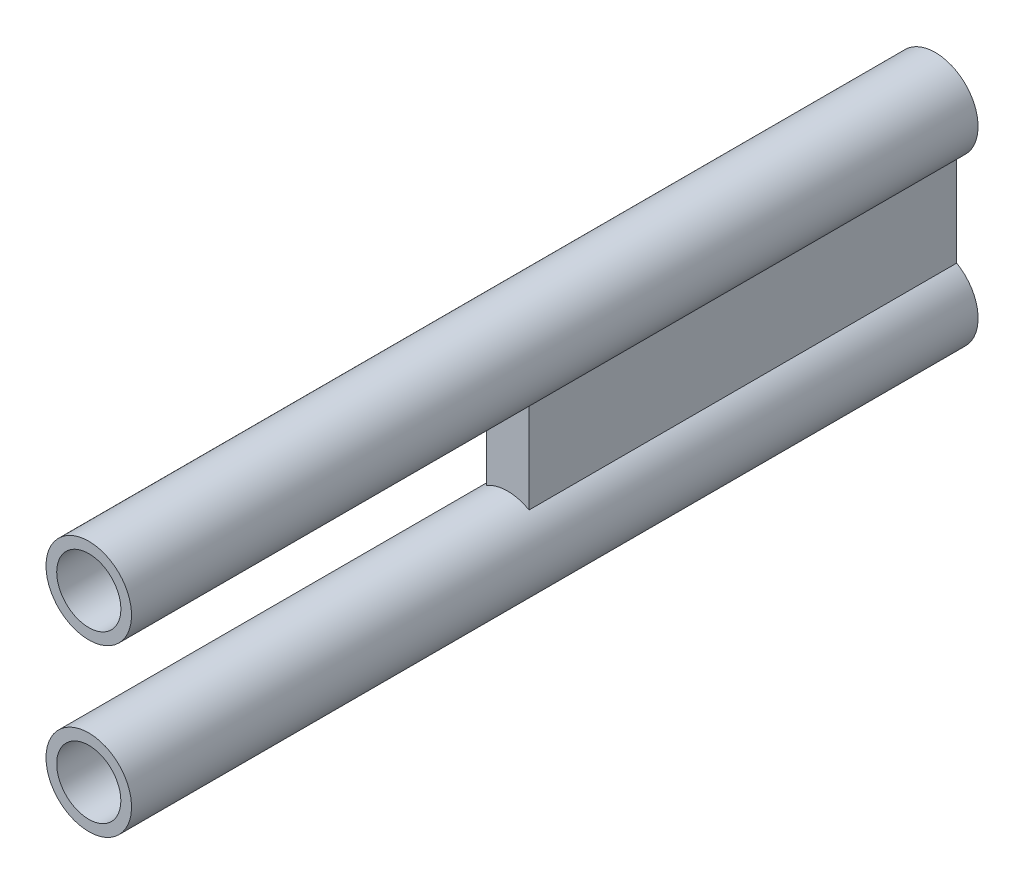
ISO-10303-21;
HEADER;
FILE_DESCRIPTION(('STEP AP214'),'2;1');
FILE_NAME('part.step','',(''),(''),'','','');
FILE_SCHEMA(('AUTOMOTIVE_DESIGN { 1 0 10303 214 1 1 1 1 }'));
ENDSEC;
DATA;
#1=APPLICATION_CONTEXT('core data for automotive mechanical design processes');
#2=APPLICATION_PROTOCOL_DEFINITION('international standard','automotive_design',2000,#1);
#3=PRODUCT_CONTEXT('',#1,'mechanical');
#4=PRODUCT('Part','Part','',(#3));
#5=PRODUCT_RELATED_PRODUCT_CATEGORY('part','',(#4));
#6=PRODUCT_DEFINITION_FORMATION('','',#4);
#7=PRODUCT_DEFINITION_CONTEXT('part definition',#1,'design');
#8=PRODUCT_DEFINITION('design','',#6,#7);
#9=PRODUCT_DEFINITION_SHAPE('','',#8);
#10=(LENGTH_UNIT() NAMED_UNIT(*) SI_UNIT(.MILLI.,.METRE.));
#11=(NAMED_UNIT(*) PLANE_ANGLE_UNIT() SI_UNIT($,.RADIAN.));
#12=(NAMED_UNIT(*) SI_UNIT($,.STERADIAN.) SOLID_ANGLE_UNIT());
#13=UNCERTAINTY_MEASURE_WITH_UNIT(LENGTH_MEASURE(1.E-05),#10,'distance_accuracy_value','');
#14=(GEOMETRIC_REPRESENTATION_CONTEXT(3) GLOBAL_UNCERTAINTY_ASSIGNED_CONTEXT((#13)) GLOBAL_UNIT_ASSIGNED_CONTEXT((#10,
#11,#12)) REPRESENTATION_CONTEXT('',''));
#15=CARTESIAN_POINT('',(0.,0.,0.));
#16=DIRECTION('',(0.,0.,1.));
#17=DIRECTION('',(1.,0.,0.));
#18=AXIS2_PLACEMENT_3D('',#15,#16,#17);
#19=CARTESIAN_POINT('',(0.,3.88205080756888,45.2453742494925));
#20=DIRECTION('',(0.,0.,-1.));
#21=DIRECTION('',(-1.,0.,0.));
#22=AXIS2_PLACEMENT_3D('',#19,#20,#21);
#23=CYLINDRICAL_SURFACE('',#22,2.);
#24=CARTESIAN_POINT('',(0.,3.88205080756888,39.5885200000001));
#25=DIRECTION('',(0.,0.,-1.));
#26=DIRECTION('',(-1.,0.,0.));
#27=AXIS2_PLACEMENT_3D('',#24,#25,#26);
#28=CIRCLE('',#27,2.);
#29=CARTESIAN_POINT('',(-2.,3.88205080756888,39.5885200000001));
#30=VERTEX_POINT('',#29);
#31=EDGE_CURVE('E11',#30,#30,#28,.T.);
#32=ORIENTED_EDGE('',*,*,#31,.T.);
#33=EDGE_LOOP('',(#32));
#34=FACE_BOUND('',#33,.T.);
#35=DIRECTION('',(0.,0.,-1.));
#36=VECTOR('',#35,1.);
#37=CARTESIAN_POINT('',(1.,2.15,20.));
#38=LINE('',#37,#36);
#39=CARTESIAN_POINT('',(1.,2.15,20.));
#40=VERTEX_POINT('',#39);
#41=CARTESIAN_POINT('',(1.,2.15,0.));
#42=VERTEX_POINT('',#41);
#43=EDGE_CURVE('E109',#40,#42,#38,.T.);
#44=ORIENTED_EDGE('',*,*,#43,.T.);
#45=CARTESIAN_POINT('',(0.,3.88205080756888,0.));
#46=DIRECTION('',(0.,0.,1.));
#47=DIRECTION('',(1.,0.,0.));
#48=AXIS2_PLACEMENT_3D('',#45,#46,#47);
#49=CIRCLE('',#48,2.);
#50=CARTESIAN_POINT('',(-1.,2.15,0.));
#51=VERTEX_POINT('',#50);
#52=EDGE_CURVE('E115',#42,#51,#49,.T.);
#53=ORIENTED_EDGE('',*,*,#52,.T.);
#54=DIRECTION('',(0.,0.,-1.));
#55=VECTOR('',#54,1.);
#56=CARTESIAN_POINT('',(-1.,2.15,20.));
#57=LINE('',#56,#55);
#58=CARTESIAN_POINT('',(-1.,2.15,20.));
#59=VERTEX_POINT('',#58);
#60=EDGE_CURVE('E57',#59,#51,#57,.T.);
#61=ORIENTED_EDGE('',*,*,#60,.F.);
#62=CARTESIAN_POINT('',(0.,3.88205080756888,20.));
#63=DIRECTION('',(0.,0.,1.));
#64=DIRECTION('',(1.,0.,0.));
#65=AXIS2_PLACEMENT_3D('',#62,#63,#64);
#66=CIRCLE('',#65,2.);
#67=EDGE_CURVE('E52',#59,#40,#66,.T.);
#68=ORIENTED_EDGE('',*,*,#67,.T.);
#69=EDGE_LOOP('',(#44,#53,#61,#68));
#70=FACE_BOUND('',#69,.T.);
#71=ADVANCED_FACE('F37',(#34,#70),#23,.T.);
#72=CARTESIAN_POINT('',(0.,3.88205080756888,45.2453742494925));
#73=DIRECTION('',(0.,0.,-1.));
#74=DIRECTION('',(-1.,0.,0.));
#75=AXIS2_PLACEMENT_3D('',#72,#73,#74);
#76=CYLINDRICAL_SURFACE('',#75,1.5);
#77=CARTESIAN_POINT('',(0.,3.88205080756888,39.5885200000001));
#78=DIRECTION('',(0.,0.,-1.));
#79=DIRECTION('',(-1.,0.,0.));
#80=AXIS2_PLACEMENT_3D('',#77,#78,#79);
#81=CIRCLE('',#80,1.5);
#82=CARTESIAN_POINT('',(-1.5,3.88205080756888,39.5885200000001));
#83=VERTEX_POINT('',#82);
#84=EDGE_CURVE('E45',#83,#83,#81,.T.);
#85=ORIENTED_EDGE('',*,*,#84,.F.);
#86=EDGE_LOOP('',(#85));
#87=FACE_BOUND('',#86,.T.);
#88=CARTESIAN_POINT('',(0.,3.88205080756888,0.));
#89=DIRECTION('',(0.,0.,1.));
#90=DIRECTION('',(1.,0.,0.));
#91=AXIS2_PLACEMENT_3D('',#88,#89,#90);
#92=CIRCLE('',#91,1.5);
#93=CARTESIAN_POINT('',(1.5,3.88205080756888,0.));
#94=VERTEX_POINT('',#93);
#95=EDGE_CURVE('E112',#94,#94,#92,.T.);
#96=ORIENTED_EDGE('',*,*,#95,.F.);
#97=EDGE_LOOP('',(#96));
#98=FACE_BOUND('',#97,.T.);
#99=ADVANCED_FACE('F39',(#87,#98),#76,.F.);
#100=CARTESIAN_POINT('',(0.,0.,0.));
#101=DIRECTION('',(0.,0.,1.));
#102=DIRECTION('',(1.,0.,0.));
#103=AXIS2_PLACEMENT_3D('',#100,#101,#102);
#104=PLANE('',#103);
#105=ORIENTED_EDGE('',*,*,#95,.T.);
#106=EDGE_LOOP('',(#105));
#107=FACE_BOUND('',#106,.T.);
#108=ORIENTED_EDGE('',*,*,#52,.F.);
#109=DIRECTION('',(0.,1.,0.));
#110=VECTOR('',#109,1.);
#111=CARTESIAN_POINT('',(1.,0.,0.));
#112=LINE('',#111,#110);
#113=CARTESIAN_POINT('',(1.,-2.15,0.));
#114=VERTEX_POINT('',#113);
#115=EDGE_CURVE('E99',#114,#42,#112,.T.);
#116=ORIENTED_EDGE('',*,*,#115,.F.);
#117=CARTESIAN_POINT('',(0.,-3.88205080756888,0.));
#118=DIRECTION('',(0.,0.,1.));
#119=DIRECTION('',(1.,0.,0.));
#120=AXIS2_PLACEMENT_3D('',#117,#118,#119);
#121=CIRCLE('',#120,2.);
#122=CARTESIAN_POINT('',(-1.,-2.15,0.));
#123=VERTEX_POINT('',#122);
#124=EDGE_CURVE('E122',#123,#114,#121,.T.);
#125=ORIENTED_EDGE('',*,*,#124,.F.);
#126=DIRECTION('',(0.,1.,0.));
#127=VECTOR('',#126,1.);
#128=CARTESIAN_POINT('',(-1.,0.,0.));
#129=LINE('',#128,#127);
#130=EDGE_CURVE('E89',#123,#51,#129,.T.);
#131=ORIENTED_EDGE('',*,*,#130,.T.);
#132=EDGE_LOOP('',(#108,#116,#125,#131));
#133=FACE_BOUND('',#132,.T.);
#134=CARTESIAN_POINT('',(0.,-3.88205080756888,0.));
#135=DIRECTION('',(0.,0.,1.));
#136=DIRECTION('',(1.,0.,0.));
#137=AXIS2_PLACEMENT_3D('',#134,#135,#136);
#138=CIRCLE('',#137,1.5);
#139=CARTESIAN_POINT('',(1.5,-3.88205080756888,0.));
#140=VERTEX_POINT('',#139);
#141=EDGE_CURVE('E124',#140,#140,#138,.T.);
#142=ORIENTED_EDGE('',*,*,#141,.T.);
#143=EDGE_LOOP('',(#142));
#144=FACE_BOUND('',#143,.T.);
#145=ADVANCED_FACE('F120',(#107,#133,#144),#104,.F.);
#146=CARTESIAN_POINT('',(24.9243285522459,-122.806311671819,39.5885200000002));
#147=DIRECTION('',(0.,0.,-1.));
#148=DIRECTION('',(1.,0.,0.));
#149=AXIS2_PLACEMENT_3D('',#146,#147,#148);
#150=PLANE('',#149);
#151=ORIENTED_EDGE('',*,*,#84,.T.);
#152=EDGE_LOOP('',(#151));
#153=FACE_BOUND('',#152,.T.);
#154=ORIENTED_EDGE('',*,*,#31,.F.);
#155=EDGE_LOOP('',(#154));
#156=FACE_BOUND('',#155,.T.);
#157=ADVANCED_FACE('F155',(#153,#156),#150,.F.);
#158=CARTESIAN_POINT('',(1.,0.,20.));
#159=DIRECTION('',(-1.,0.,0.));
#160=DIRECTION('',(0.,0.,1.));
#161=AXIS2_PLACEMENT_3D('',#158,#159,#160);
#162=PLANE('',#161);
#163=ORIENTED_EDGE('',*,*,#115,.T.);
#164=ORIENTED_EDGE('',*,*,#43,.F.);
#165=DIRECTION('',(0.,1.,0.));
#166=VECTOR('',#165,1.);
#167=CARTESIAN_POINT('',(1.,0.,20.));
#168=LINE('',#167,#166);
#169=CARTESIAN_POINT('',(1.,-2.15,20.));
#170=VERTEX_POINT('',#169);
#171=EDGE_CURVE('E96',#170,#40,#168,.T.);
#172=ORIENTED_EDGE('',*,*,#171,.F.);
#173=DIRECTION('',(0.,0.,-1.));
#174=VECTOR('',#173,1.);
#175=CARTESIAN_POINT('',(1.,-2.15,20.));
#176=LINE('',#175,#174);
#177=EDGE_CURVE('E95',#170,#114,#176,.T.);
#178=ORIENTED_EDGE('',*,*,#177,.T.);
#179=EDGE_LOOP('',(#163,#164,#172,#178));
#180=FACE_BOUND('',#179,.T.);
#181=ADVANCED_FACE('F159',(#180),#162,.F.);
#182=CARTESIAN_POINT('',(-1.,0.,20.));
#183=DIRECTION('',(-1.,0.,0.));
#184=DIRECTION('',(0.,0.,1.));
#185=AXIS2_PLACEMENT_3D('',#182,#183,#184);
#186=PLANE('',#185);
#187=ORIENTED_EDGE('',*,*,#130,.F.);
#188=DIRECTION('',(0.,0.,-1.));
#189=VECTOR('',#188,1.);
#190=CARTESIAN_POINT('',(-1.,-2.15,20.));
#191=LINE('',#190,#189);
#192=CARTESIAN_POINT('',(-1.,-2.15,20.));
#193=VERTEX_POINT('',#192);
#194=EDGE_CURVE('E84',#193,#123,#191,.T.);
#195=ORIENTED_EDGE('',*,*,#194,.F.);
#196=DIRECTION('',(0.,1.,0.));
#197=VECTOR('',#196,1.);
#198=CARTESIAN_POINT('',(-1.,0.,20.));
#199=LINE('',#198,#197);
#200=EDGE_CURVE('E77',#193,#59,#199,.T.);
#201=ORIENTED_EDGE('',*,*,#200,.T.);
#202=ORIENTED_EDGE('',*,*,#60,.T.);
#203=EDGE_LOOP('',(#187,#195,#201,#202));
#204=FACE_BOUND('',#203,.T.);
#205=ADVANCED_FACE('F87',(#204),#186,.T.);
#206=CARTESIAN_POINT('',(0.,0.,20.));
#207=DIRECTION('',(0.,0.,1.));
#208=DIRECTION('',(1.,0.,0.));
#209=AXIS2_PLACEMENT_3D('',#206,#207,#208);
#210=PLANE('',#209);
#211=CARTESIAN_POINT('',(0.,-3.88205080756888,20.));
#212=DIRECTION('',(0.,0.,1.));
#213=DIRECTION('',(1.,0.,0.));
#214=AXIS2_PLACEMENT_3D('',#211,#212,#213);
#215=CIRCLE('',#214,2.);
#216=EDGE_CURVE('E81',#170,#193,#215,.T.);
#217=ORIENTED_EDGE('',*,*,#216,.F.);
#218=ORIENTED_EDGE('',*,*,#171,.T.);
#219=ORIENTED_EDGE('',*,*,#67,.F.);
#220=ORIENTED_EDGE('',*,*,#200,.F.);
#221=EDGE_LOOP('',(#217,#218,#219,#220));
#222=FACE_BOUND('',#221,.T.);
#223=ADVANCED_FACE('F79',(#222),#210,.T.);
#224=CARTESIAN_POINT('',(0.,-3.88205080756888,45.2453742494925));
#225=DIRECTION('',(0.,0.,-1.));
#226=DIRECTION('',(-1.,0.,0.));
#227=AXIS2_PLACEMENT_3D('',#224,#225,#226);
#228=CYLINDRICAL_SURFACE('',#227,2.);
#229=CARTESIAN_POINT('',(0.,-3.88205080756888,39.5885200000001));
#230=DIRECTION('',(0.,0.,-1.));
#231=DIRECTION('',(-1.,0.,0.));
#232=AXIS2_PLACEMENT_3D('',#229,#230,#231);
#233=CIRCLE('',#232,2.);
#234=CARTESIAN_POINT('',(-2.,-3.88205080756888,39.5885200000001));
#235=VERTEX_POINT('',#234);
#236=EDGE_CURVE('E102',#235,#235,#233,.T.);
#237=ORIENTED_EDGE('',*,*,#236,.T.);
#238=EDGE_LOOP('',(#237));
#239=FACE_BOUND('',#238,.T.);
#240=ORIENTED_EDGE('',*,*,#124,.T.);
#241=ORIENTED_EDGE('',*,*,#177,.F.);
#242=ORIENTED_EDGE('',*,*,#216,.T.);
#243=ORIENTED_EDGE('',*,*,#194,.T.);
#244=EDGE_LOOP('',(#240,#241,#242,#243));
#245=FACE_BOUND('',#244,.T.);
#246=ADVANCED_FACE('F94',(#239,#245),#228,.T.);
#247=CARTESIAN_POINT('',(0.,-3.88205080756888,45.2453742494925));
#248=DIRECTION('',(0.,0.,-1.));
#249=DIRECTION('',(-1.,0.,0.));
#250=AXIS2_PLACEMENT_3D('',#247,#248,#249);
#251=CYLINDRICAL_SURFACE('',#250,1.5);
#252=CARTESIAN_POINT('',(-1.31838984174237E-13,-3.88205080756892,39.5885200000001));
#253=DIRECTION('',(0.,0.,-1.));
#254=DIRECTION('',(1.,0.,0.));
#255=AXIS2_PLACEMENT_3D('',#252,#253,#254);
#256=CIRCLE('',#255,1.5);
#257=CARTESIAN_POINT('',(1.49999999999987,-3.88205080756892,39.5885200000001));
#258=VERTEX_POINT('',#257);
#259=EDGE_CURVE('E123',#258,#258,#256,.T.);
#260=ORIENTED_EDGE('',*,*,#259,.F.);
#261=EDGE_LOOP('',(#260));
#262=FACE_BOUND('',#261,.T.);
#263=ORIENTED_EDGE('',*,*,#141,.F.);
#264=EDGE_LOOP('',(#263));
#265=FACE_BOUND('',#264,.T.);
#266=ADVANCED_FACE('F131',(#262,#265),#251,.F.);
#267=CARTESIAN_POINT('',(24.9243285522459,-122.806311671819,39.5885200000002));
#268=DIRECTION('',(0.,0.,-1.));
#269=DIRECTION('',(1.,0.,0.));
#270=AXIS2_PLACEMENT_3D('',#267,#268,#269);
#271=PLANE('',#270);
#272=ORIENTED_EDGE('',*,*,#259,.T.);
#273=EDGE_LOOP('',(#272));
#274=FACE_BOUND('',#273,.T.);
#275=ORIENTED_EDGE('',*,*,#236,.F.);
#276=EDGE_LOOP('',(#275));
#277=FACE_BOUND('',#276,.T.);
#278=ADVANCED_FACE('F133',(#274,#277),#271,.F.);
#279=CLOSED_SHELL('',(#71,#99,#145,#157,#181,#205,#223,#246,#266,#278));
#280=MANIFOLD_SOLID_BREP('B2',#279);
#281=ADVANCED_BREP_SHAPE_REPRESENTATION('',(#18,#280),#14);
#282=SHAPE_DEFINITION_REPRESENTATION(#9,#281);
ENDSEC;
END-ISO-10303-21;
